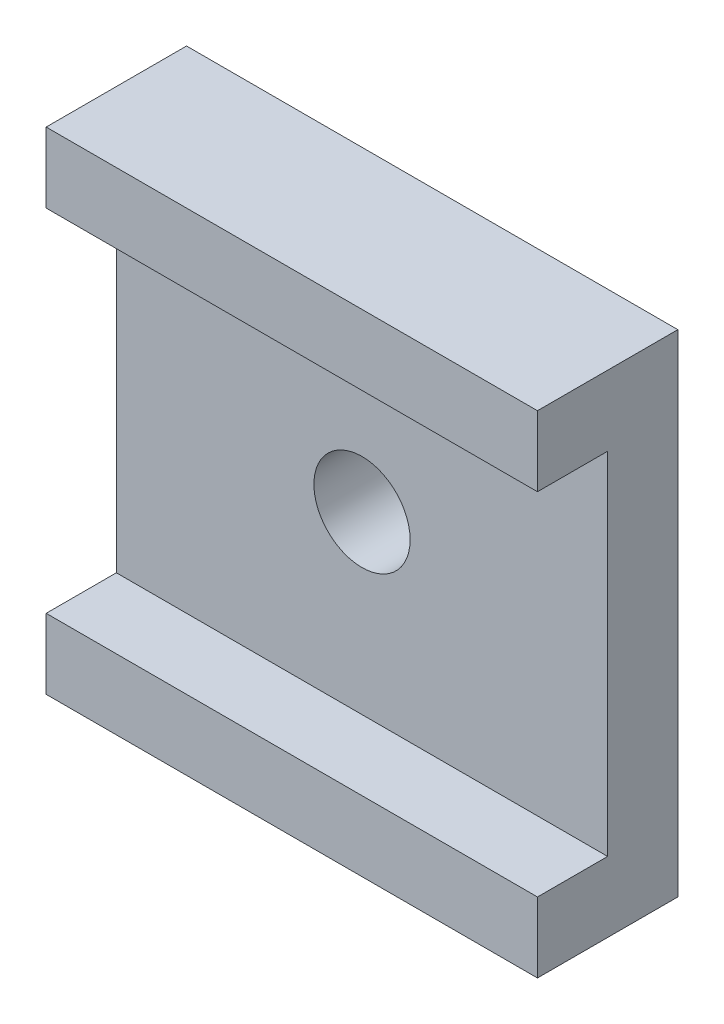
ISO-10303-21;
HEADER;
FILE_DESCRIPTION(('STEP AP214'),'2;1');
FILE_NAME('part.step','',(''),(''),'','','');
FILE_SCHEMA(('AUTOMOTIVE_DESIGN { 1 0 10303 214 1 1 1 1 }'));
ENDSEC;
DATA;
#1=APPLICATION_CONTEXT('core data for automotive mechanical design processes');
#2=APPLICATION_PROTOCOL_DEFINITION('international standard','automotive_design',2000,#1);
#3=PRODUCT_CONTEXT('',#1,'mechanical');
#4=PRODUCT('Part','Part','',(#3));
#5=PRODUCT_RELATED_PRODUCT_CATEGORY('part','',(#4));
#6=PRODUCT_DEFINITION_FORMATION('','',#4);
#7=PRODUCT_DEFINITION_CONTEXT('part definition',#1,'design');
#8=PRODUCT_DEFINITION('design','',#6,#7);
#9=PRODUCT_DEFINITION_SHAPE('','',#8);
#10=(LENGTH_UNIT() NAMED_UNIT(*) SI_UNIT(.MILLI.,.METRE.));
#11=(NAMED_UNIT(*) PLANE_ANGLE_UNIT() SI_UNIT($,.RADIAN.));
#12=(NAMED_UNIT(*) SI_UNIT($,.STERADIAN.) SOLID_ANGLE_UNIT());
#13=UNCERTAINTY_MEASURE_WITH_UNIT(LENGTH_MEASURE(1.E-05),#10,'distance_accuracy_value','');
#14=(GEOMETRIC_REPRESENTATION_CONTEXT(3) GLOBAL_UNCERTAINTY_ASSIGNED_CONTEXT((#13)) GLOBAL_UNIT_ASSIGNED_CONTEXT((#10,
#11,#12)) REPRESENTATION_CONTEXT('',''));
#15=CARTESIAN_POINT('',(0.,0.,0.));
#16=DIRECTION('',(0.,0.,1.));
#17=DIRECTION('',(1.,0.,0.));
#18=AXIS2_PLACEMENT_3D('',#15,#16,#17);
#19=CARTESIAN_POINT('',(0.,0.,20.));
#20=DIRECTION('',(0.,0.,-1.));
#21=DIRECTION('',(-1.,0.,0.));
#22=AXIS2_PLACEMENT_3D('',#19,#20,#21);
#23=PLANE('',#22);
#24=DIRECTION('',(0.,-1.,0.));
#25=VECTOR('',#24,1.);
#26=CARTESIAN_POINT('',(0.,0.,20.));
#27=LINE('',#26,#25);
#28=CARTESIAN_POINT('',(0.,70.,20.));
#29=VERTEX_POINT('',#28);
#30=CARTESIAN_POINT('',(0.,60.,20.));
#31=VERTEX_POINT('',#30);
#32=EDGE_CURVE('E135',#29,#31,#27,.T.);
#33=ORIENTED_EDGE('',*,*,#32,.T.);
#34=DIRECTION('',(-1.,0.,0.));
#35=VECTOR('',#34,1.);
#36=CARTESIAN_POINT('',(0.,60.,20.));
#37=LINE('',#36,#35);
#38=CARTESIAN_POINT('',(70.,60.,20.));
#39=VERTEX_POINT('',#38);
#40=EDGE_CURVE('E126',#39,#31,#37,.T.);
#41=ORIENTED_EDGE('',*,*,#40,.F.);
#42=DIRECTION('',(0.,1.,0.));
#43=VECTOR('',#42,1.);
#44=CARTESIAN_POINT('',(70.,0.,20.));
#45=LINE('',#44,#43);
#46=CARTESIAN_POINT('',(70.,70.,20.));
#47=VERTEX_POINT('',#46);
#48=EDGE_CURVE('E139',#39,#47,#45,.T.);
#49=ORIENTED_EDGE('',*,*,#48,.T.);
#50=DIRECTION('',(-1.,0.,0.));
#51=VECTOR('',#50,1.);
#52=CARTESIAN_POINT('',(0.,70.,20.));
#53=LINE('',#52,#51);
#54=EDGE_CURVE('E60',#47,#29,#53,.T.);
#55=ORIENTED_EDGE('',*,*,#54,.T.);
#56=EDGE_LOOP('',(#33,#41,#49,#55));
#57=FACE_BOUND('',#56,.T.);
#58=ADVANCED_FACE('F36',(#57),#23,.F.);
#59=CARTESIAN_POINT('',(0.,0.,20.));
#60=DIRECTION('',(1.,0.,0.));
#61=DIRECTION('',(0.,0.,-1.));
#62=AXIS2_PLACEMENT_3D('',#59,#60,#61);
#63=PLANE('',#62);
#64=DIRECTION('',(0.,-1.,0.));
#65=VECTOR('',#64,1.);
#66=CARTESIAN_POINT('',(0.,10.,10.));
#67=LINE('',#66,#65);
#68=CARTESIAN_POINT('',(0.,60.,10.));
#69=VERTEX_POINT('',#68);
#70=CARTESIAN_POINT('',(0.,10.,10.));
#71=VERTEX_POINT('',#70);
#72=EDGE_CURVE('E117',#69,#71,#67,.T.);
#73=ORIENTED_EDGE('',*,*,#72,.F.);
#74=DIRECTION('',(0.,0.,1.));
#75=VECTOR('',#74,1.);
#76=CARTESIAN_POINT('',(0.,60.,10.));
#77=LINE('',#76,#75);
#78=EDGE_CURVE('E149',#69,#31,#77,.T.);
#79=ORIENTED_EDGE('',*,*,#78,.T.);
#80=ORIENTED_EDGE('',*,*,#32,.F.);
#81=DIRECTION('',(0.,0.,-1.));
#82=VECTOR('',#81,1.);
#83=CARTESIAN_POINT('',(0.,70.,20.));
#84=LINE('',#83,#82);
#85=CARTESIAN_POINT('',(0.,70.,0.));
#86=VERTEX_POINT('',#85);
#87=EDGE_CURVE('E144',#29,#86,#84,.T.);
#88=ORIENTED_EDGE('',*,*,#87,.T.);
#89=DIRECTION('',(0.,-1.,0.));
#90=VECTOR('',#89,1.);
#91=CARTESIAN_POINT('',(0.,0.,0.));
#92=LINE('',#91,#90);
#93=CARTESIAN_POINT('',(0.,0.,0.));
#94=VERTEX_POINT('',#93);
#95=EDGE_CURVE('E145',#86,#94,#92,.T.);
#96=ORIENTED_EDGE('',*,*,#95,.T.);
#97=DIRECTION('',(0.,0.,-1.));
#98=VECTOR('',#97,1.);
#99=CARTESIAN_POINT('',(0.,0.,20.));
#100=LINE('',#99,#98);
#101=CARTESIAN_POINT('',(0.,0.,20.));
#102=VERTEX_POINT('',#101);
#103=EDGE_CURVE('E11',#102,#94,#100,.T.);
#104=ORIENTED_EDGE('',*,*,#103,.F.);
#105=CARTESIAN_POINT('',(0.,10.,20.));
#106=VERTEX_POINT('',#105);
#107=EDGE_CURVE('E88',#106,#102,#27,.T.);
#108=ORIENTED_EDGE('',*,*,#107,.F.);
#109=DIRECTION('',(0.,0.,1.));
#110=VECTOR('',#109,1.);
#111=CARTESIAN_POINT('',(0.,10.,10.));
#112=LINE('',#111,#110);
#113=EDGE_CURVE('E51',#71,#106,#112,.T.);
#114=ORIENTED_EDGE('',*,*,#113,.F.);
#115=EDGE_LOOP('',(#73,#79,#80,#88,#96,#104,#108,#114));
#116=FACE_BOUND('',#115,.T.);
#117=ADVANCED_FACE('F38',(#116),#63,.F.);
#118=CARTESIAN_POINT('',(0.,0.,20.));
#119=DIRECTION('',(0.,1.,0.));
#120=DIRECTION('',(0.,0.,1.));
#121=AXIS2_PLACEMENT_3D('',#118,#119,#120);
#122=PLANE('',#121);
#123=DIRECTION('',(1.,0.,0.));
#124=VECTOR('',#123,1.);
#125=CARTESIAN_POINT('',(0.,0.,0.));
#126=LINE('',#125,#124);
#127=CARTESIAN_POINT('',(70.,0.,0.));
#128=VERTEX_POINT('',#127);
#129=EDGE_CURVE('E148',#94,#128,#126,.T.);
#130=ORIENTED_EDGE('',*,*,#129,.T.);
#131=DIRECTION('',(0.,0.,-1.));
#132=VECTOR('',#131,1.);
#133=CARTESIAN_POINT('',(70.,0.,20.));
#134=LINE('',#133,#132);
#135=CARTESIAN_POINT('',(70.,0.,20.));
#136=VERTEX_POINT('',#135);
#137=EDGE_CURVE('E44',#136,#128,#134,.T.);
#138=ORIENTED_EDGE('',*,*,#137,.F.);
#139=DIRECTION('',(1.,0.,0.));
#140=VECTOR('',#139,1.);
#141=CARTESIAN_POINT('',(0.,0.,20.));
#142=LINE('',#141,#140);
#143=EDGE_CURVE('E137',#102,#136,#142,.T.);
#144=ORIENTED_EDGE('',*,*,#143,.F.);
#145=ORIENTED_EDGE('',*,*,#103,.T.);
#146=EDGE_LOOP('',(#130,#138,#144,#145));
#147=FACE_BOUND('',#146,.T.);
#148=ADVANCED_FACE('F195',(#147),#122,.F.);
#149=CARTESIAN_POINT('',(70.,0.,20.));
#150=DIRECTION('',(-1.,0.,0.));
#151=DIRECTION('',(0.,0.,1.));
#152=AXIS2_PLACEMENT_3D('',#149,#150,#151);
#153=PLANE('',#152);
#154=ORIENTED_EDGE('',*,*,#48,.F.);
#155=DIRECTION('',(0.,0.,1.));
#156=VECTOR('',#155,1.);
#157=CARTESIAN_POINT('',(70.,60.,10.));
#158=LINE('',#157,#156);
#159=CARTESIAN_POINT('',(70.,60.,10.));
#160=VERTEX_POINT('',#159);
#161=EDGE_CURVE('E130',#160,#39,#158,.T.);
#162=ORIENTED_EDGE('',*,*,#161,.F.);
#163=DIRECTION('',(0.,1.,0.));
#164=VECTOR('',#163,1.);
#165=CARTESIAN_POINT('',(70.,10.,10.));
#166=LINE('',#165,#164);
#167=CARTESIAN_POINT('',(70.,10.,10.));
#168=VERTEX_POINT('',#167);
#169=EDGE_CURVE('E116',#168,#160,#166,.T.);
#170=ORIENTED_EDGE('',*,*,#169,.F.);
#171=DIRECTION('',(0.,0.,1.));
#172=VECTOR('',#171,1.);
#173=CARTESIAN_POINT('',(70.,10.,10.));
#174=LINE('',#173,#172);
#175=CARTESIAN_POINT('',(70.,10.,20.));
#176=VERTEX_POINT('',#175);
#177=EDGE_CURVE('E113',#168,#176,#174,.T.);
#178=ORIENTED_EDGE('',*,*,#177,.T.);
#179=EDGE_CURVE('E140',#136,#176,#45,.T.);
#180=ORIENTED_EDGE('',*,*,#179,.F.);
#181=ORIENTED_EDGE('',*,*,#137,.T.);
#182=DIRECTION('',(0.,1.,0.));
#183=VECTOR('',#182,1.);
#184=CARTESIAN_POINT('',(70.,0.,0.));
#185=LINE('',#184,#183);
#186=CARTESIAN_POINT('',(70.,70.,0.));
#187=VERTEX_POINT('',#186);
#188=EDGE_CURVE('E151',#128,#187,#185,.T.);
#189=ORIENTED_EDGE('',*,*,#188,.T.);
#190=DIRECTION('',(0.,0.,-1.));
#191=VECTOR('',#190,1.);
#192=CARTESIAN_POINT('',(70.,70.,20.));
#193=LINE('',#192,#191);
#194=EDGE_CURVE('E155',#47,#187,#193,.T.);
#195=ORIENTED_EDGE('',*,*,#194,.F.);
#196=EDGE_LOOP('',(#154,#162,#170,#178,#180,#181,#189,#195));
#197=FACE_BOUND('',#196,.T.);
#198=ADVANCED_FACE('F162',(#197),#153,.F.);
#199=CARTESIAN_POINT('',(0.,70.,20.));
#200=DIRECTION('',(0.,-1.,0.));
#201=DIRECTION('',(0.,0.,-1.));
#202=AXIS2_PLACEMENT_3D('',#199,#200,#201);
#203=PLANE('',#202);
#204=DIRECTION('',(-1.,0.,0.));
#205=VECTOR('',#204,1.);
#206=CARTESIAN_POINT('',(0.,70.,0.));
#207=LINE('',#206,#205);
#208=EDGE_CURVE('E81',#187,#86,#207,.T.);
#209=ORIENTED_EDGE('',*,*,#208,.T.);
#210=ORIENTED_EDGE('',*,*,#87,.F.);
#211=ORIENTED_EDGE('',*,*,#54,.F.);
#212=ORIENTED_EDGE('',*,*,#194,.T.);
#213=EDGE_LOOP('',(#209,#210,#211,#212));
#214=FACE_BOUND('',#213,.T.);
#215=ADVANCED_FACE('F169',(#214),#203,.F.);
#216=ORIENTED_EDGE('',*,*,#179,.T.);
#217=DIRECTION('',(1.,0.,0.));
#218=VECTOR('',#217,1.);
#219=CARTESIAN_POINT('',(0.,10.,20.));
#220=LINE('',#219,#218);
#221=EDGE_CURVE('E173',#106,#176,#220,.T.);
#222=ORIENTED_EDGE('',*,*,#221,.F.);
#223=ORIENTED_EDGE('',*,*,#107,.T.);
#224=ORIENTED_EDGE('',*,*,#143,.T.);
#225=EDGE_LOOP('',(#216,#222,#223,#224));
#226=FACE_BOUND('',#225,.T.);
#227=ADVANCED_FACE('F186',(#226),#23,.F.);
#228=CARTESIAN_POINT('',(0.,0.,0.));
#229=DIRECTION('',(0.,0.,-1.));
#230=DIRECTION('',(-1.,0.,0.));
#231=AXIS2_PLACEMENT_3D('',#228,#229,#230);
#232=PLANE('',#231);
#233=CARTESIAN_POINT('',(35.,35.,0.));
#234=DIRECTION('',(0.,0.,1.));
#235=DIRECTION('',(1.,0.,0.));
#236=AXIS2_PLACEMENT_3D('',#233,#234,#235);
#237=CIRCLE('',#236,6.85602034974083);
#238=CARTESIAN_POINT('',(41.8560203497408,35.,0.));
#239=VERTEX_POINT('',#238);
#240=EDGE_CURVE('E175',#239,#239,#237,.T.);
#241=ORIENTED_EDGE('',*,*,#240,.T.);
#242=EDGE_LOOP('',(#241));
#243=FACE_BOUND('',#242,.T.);
#244=ORIENTED_EDGE('',*,*,#95,.F.);
#245=ORIENTED_EDGE('',*,*,#208,.F.);
#246=ORIENTED_EDGE('',*,*,#188,.F.);
#247=ORIENTED_EDGE('',*,*,#129,.F.);
#248=EDGE_LOOP('',(#244,#245,#246,#247));
#249=FACE_BOUND('',#248,.T.);
#250=ADVANCED_FACE('F167',(#243,#249),#232,.T.);
#251=CARTESIAN_POINT('',(0.,60.,10.));
#252=DIRECTION('',(0.,1.,0.));
#253=DIRECTION('',(0.,0.,1.));
#254=AXIS2_PLACEMENT_3D('',#251,#252,#253);
#255=PLANE('',#254);
#256=ORIENTED_EDGE('',*,*,#40,.T.);
#257=ORIENTED_EDGE('',*,*,#78,.F.);
#258=DIRECTION('',(-1.,0.,0.));
#259=VECTOR('',#258,1.);
#260=CARTESIAN_POINT('',(0.,60.,10.));
#261=LINE('',#260,#259);
#262=EDGE_CURVE('E123',#160,#69,#261,.T.);
#263=ORIENTED_EDGE('',*,*,#262,.F.);
#264=ORIENTED_EDGE('',*,*,#161,.T.);
#265=EDGE_LOOP('',(#256,#257,#263,#264));
#266=FACE_BOUND('',#265,.T.);
#267=ADVANCED_FACE('F178',(#266),#255,.F.);
#268=CARTESIAN_POINT('',(0.,10.,10.));
#269=DIRECTION('',(0.,-1.,0.));
#270=DIRECTION('',(1.,0.,0.));
#271=AXIS2_PLACEMENT_3D('',#268,#269,#270);
#272=PLANE('',#271);
#273=ORIENTED_EDGE('',*,*,#221,.T.);
#274=ORIENTED_EDGE('',*,*,#177,.F.);
#275=DIRECTION('',(1.,0.,0.));
#276=VECTOR('',#275,1.);
#277=CARTESIAN_POINT('',(0.,10.,10.));
#278=LINE('',#277,#276);
#279=EDGE_CURVE('E109',#71,#168,#278,.T.);
#280=ORIENTED_EDGE('',*,*,#279,.F.);
#281=ORIENTED_EDGE('',*,*,#113,.T.);
#282=EDGE_LOOP('',(#273,#274,#280,#281));
#283=FACE_BOUND('',#282,.T.);
#284=ADVANCED_FACE('F111',(#283),#272,.F.);
#285=CARTESIAN_POINT('',(0.,0.,10.));
#286=DIRECTION('',(0.,0.,-1.));
#287=DIRECTION('',(-1.,0.,0.));
#288=AXIS2_PLACEMENT_3D('',#285,#286,#287);
#289=PLANE('',#288);
#290=CARTESIAN_POINT('',(35.,35.,10.));
#291=DIRECTION('',(0.,0.,1.));
#292=DIRECTION('',(1.,0.,0.));
#293=AXIS2_PLACEMENT_3D('',#290,#291,#292);
#294=CIRCLE('',#293,6.85602034974083);
#295=CARTESIAN_POINT('',(41.8560203497408,35.,10.));
#296=VERTEX_POINT('',#295);
#297=EDGE_CURVE('E270',#296,#296,#294,.T.);
#298=ORIENTED_EDGE('',*,*,#297,.F.);
#299=EDGE_LOOP('',(#298));
#300=FACE_BOUND('',#299,.T.);
#301=ORIENTED_EDGE('',*,*,#72,.T.);
#302=ORIENTED_EDGE('',*,*,#279,.T.);
#303=ORIENTED_EDGE('',*,*,#169,.T.);
#304=ORIENTED_EDGE('',*,*,#262,.T.);
#305=EDGE_LOOP('',(#301,#302,#303,#304));
#306=FACE_BOUND('',#305,.T.);
#307=ADVANCED_FACE('F121',(#300,#306),#289,.F.);
#308=CARTESIAN_POINT('',(35.,35.,0.));
#309=DIRECTION('',(0.,0.,1.));
#310=DIRECTION('',(1.,0.,0.));
#311=AXIS2_PLACEMENT_3D('',#308,#309,#310);
#312=CYLINDRICAL_SURFACE('',#311,6.85602034974083);
#313=ORIENTED_EDGE('',*,*,#240,.F.);
#314=EDGE_LOOP('',(#313));
#315=FACE_BOUND('',#314,.T.);
#316=ORIENTED_EDGE('',*,*,#297,.T.);
#317=EDGE_LOOP('',(#316));
#318=FACE_BOUND('',#317,.T.);
#319=ADVANCED_FACE('F252',(#315,#318),#312,.F.);
#320=CLOSED_SHELL('',(#58,#117,#148,#198,#215,#227,#250,#267,#284,#307,#319));
#321=MANIFOLD_SOLID_BREP('B2',#320);
#322=ADVANCED_BREP_SHAPE_REPRESENTATION('',(#18,#321),#14);
#323=SHAPE_DEFINITION_REPRESENTATION(#9,#322);
ENDSEC;
END-ISO-10303-21;
